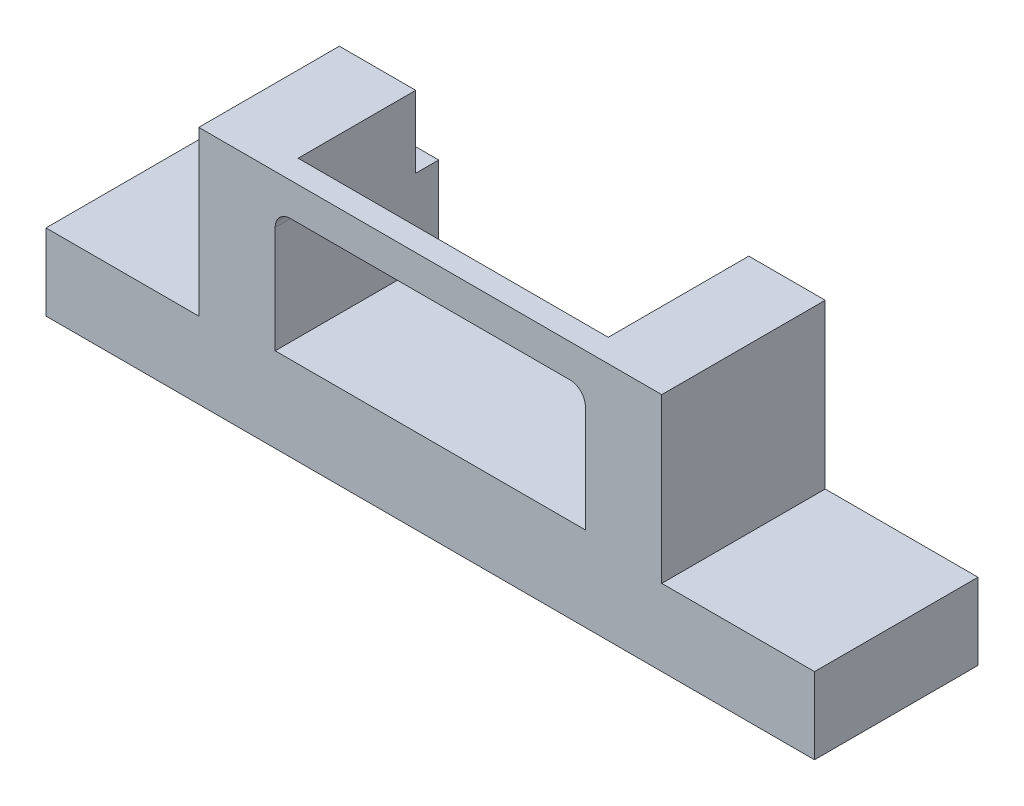
ISO-10303-21;
HEADER;
FILE_DESCRIPTION(('STEP AP214'),'2;1');
FILE_NAME('part.step','',(''),(''),'','','');
FILE_SCHEMA(('AUTOMOTIVE_DESIGN { 1 0 10303 214 1 1 1 1 }'));
ENDSEC;
DATA;
#1=APPLICATION_CONTEXT('core data for automotive mechanical design processes');
#2=APPLICATION_PROTOCOL_DEFINITION('international standard','automotive_design',2000,#1);
#3=PRODUCT_CONTEXT('',#1,'mechanical');
#4=PRODUCT('Part','Part','',(#3));
#5=PRODUCT_RELATED_PRODUCT_CATEGORY('part','',(#4));
#6=PRODUCT_DEFINITION_FORMATION('','',#4);
#7=PRODUCT_DEFINITION_CONTEXT('part definition',#1,'design');
#8=PRODUCT_DEFINITION('design','',#6,#7);
#9=PRODUCT_DEFINITION_SHAPE('','',#8);
#10=(LENGTH_UNIT() NAMED_UNIT(*) SI_UNIT(.MILLI.,.METRE.));
#11=(NAMED_UNIT(*) PLANE_ANGLE_UNIT() SI_UNIT($,.RADIAN.));
#12=(NAMED_UNIT(*) SI_UNIT($,.STERADIAN.) SOLID_ANGLE_UNIT());
#13=UNCERTAINTY_MEASURE_WITH_UNIT(LENGTH_MEASURE(1.E-05),#10,'distance_accuracy_value','');
#14=(GEOMETRIC_REPRESENTATION_CONTEXT(3) GLOBAL_UNCERTAINTY_ASSIGNED_CONTEXT((#13)) GLOBAL_UNIT_ASSIGNED_CONTEXT((#10,
#11,#12)) REPRESENTATION_CONTEXT('',''));
#15=CARTESIAN_POINT('',(0.,0.,0.));
#16=DIRECTION('',(0.,0.,1.));
#17=DIRECTION('',(1.,0.,0.));
#18=AXIS2_PLACEMENT_3D('',#15,#16,#17);
#19=CARTESIAN_POINT('',(0.,15.7,0.));
#20=DIRECTION('',(-1.,0.,0.));
#21=DIRECTION('',(0.,0.,1.));
#22=AXIS2_PLACEMENT_3D('',#19,#20,#21);
#23=PLANE('',#22);
#24=DIRECTION('',(0.,-1.,0.));
#25=VECTOR('',#24,1.);
#26=CARTESIAN_POINT('',(0.,15.7,0.));
#27=LINE('',#26,#25);
#28=CARTESIAN_POINT('',(0.,5.00000000000001,0.));
#29=VERTEX_POINT('',#28);
#30=CARTESIAN_POINT('',(0.,0.,0.));
#31=VERTEX_POINT('',#30);
#32=EDGE_CURVE('E11',#29,#31,#27,.T.);
#33=ORIENTED_EDGE('',*,*,#32,.F.);
#34=DIRECTION('',(0.,0.,1.));
#35=VECTOR('',#34,1.);
#36=CARTESIAN_POINT('',(0.,5.00000000000001,-0.000999999999999265));
#37=LINE('',#36,#35);
#38=CARTESIAN_POINT('',(0.,5.00000000000001,10.7));
#39=VERTEX_POINT('',#38);
#40=EDGE_CURVE('E304',#29,#39,#37,.T.);
#41=ORIENTED_EDGE('',*,*,#40,.T.);
#42=DIRECTION('',(0.,-1.,0.));
#43=VECTOR('',#42,1.);
#44=CARTESIAN_POINT('',(0.,15.7,10.7));
#45=LINE('',#44,#43);
#46=CARTESIAN_POINT('',(0.,0.,10.7));
#47=VERTEX_POINT('',#46);
#48=EDGE_CURVE('E250',#39,#47,#45,.T.);
#49=ORIENTED_EDGE('',*,*,#48,.T.);
#50=DIRECTION('',(0.,0.,-1.));
#51=VECTOR('',#50,1.);
#52=CARTESIAN_POINT('',(0.,0.,0.));
#53=LINE('',#52,#51);
#54=EDGE_CURVE('E251',#47,#31,#53,.T.);
#55=ORIENTED_EDGE('',*,*,#54,.T.);
#56=EDGE_LOOP('',(#33,#41,#49,#55));
#57=FACE_BOUND('',#56,.T.);
#58=ADVANCED_FACE('F39',(#57),#23,.F.);
#59=CARTESIAN_POINT('',(0.,15.7,0.));
#60=DIRECTION('',(0.,0.,1.));
#61=DIRECTION('',(1.,0.,0.));
#62=AXIS2_PLACEMENT_3D('',#59,#60,#61);
#63=PLANE('',#62);
#64=DIRECTION('',(0.,-1.,0.));
#65=VECTOR('',#64,1.);
#66=CARTESIAN_POINT('',(-40.3,5.00000000000001,0.));
#67=LINE('',#66,#65);
#68=CARTESIAN_POINT('',(-40.3,11.,0.));
#69=VERTEX_POINT('',#68);
#70=CARTESIAN_POINT('',(-40.3,5.00000000000001,0.));
#71=VERTEX_POINT('',#70);
#72=EDGE_CURVE('E182',#69,#71,#67,.T.);
#73=ORIENTED_EDGE('',*,*,#72,.F.);
#74=DIRECTION('',(-1.,0.,0.));
#75=VECTOR('',#74,1.);
#76=CARTESIAN_POINT('',(0.001000000000001,11.,0.));
#77=LINE('',#76,#75);
#78=CARTESIAN_POINT('',(-35.3,11.,0.));
#79=VERTEX_POINT('',#78);
#80=EDGE_CURVE('E166',#79,#69,#77,.T.);
#81=ORIENTED_EDGE('',*,*,#80,.F.);
#82=DIRECTION('',(0.,1.,0.));
#83=VECTOR('',#82,1.);
#84=CARTESIAN_POINT('',(-35.3,12.5329063094467,0.));
#85=LINE('',#84,#83);
#86=CARTESIAN_POINT('',(-35.3,5.5329063094467,0.));
#87=VERTEX_POINT('',#86);
#88=EDGE_CURVE('E180',#87,#79,#85,.T.);
#89=ORIENTED_EDGE('',*,*,#88,.F.);
#90=DIRECTION('',(-1.,0.,0.));
#91=VECTOR('',#90,1.);
#92=CARTESIAN_POINT('',(-35.3,5.5329063094467,0.));
#93=LINE('',#92,#91);
#94=CARTESIAN_POINT('',(-15.,5.5329063094467,0.));
#95=VERTEX_POINT('',#94);
#96=EDGE_CURVE('E223',#95,#87,#93,.T.);
#97=ORIENTED_EDGE('',*,*,#96,.F.);
#98=DIRECTION('',(0.,-1.,0.));
#99=VECTOR('',#98,1.);
#100=CARTESIAN_POINT('',(-15.,12.5329063094467,0.));
#101=LINE('',#100,#99);
#102=CARTESIAN_POINT('',(-15.,15.7,0.));
#103=VERTEX_POINT('',#102);
#104=EDGE_CURVE('E62',#103,#95,#101,.T.);
#105=ORIENTED_EDGE('',*,*,#104,.F.);
#106=DIRECTION('',(-1.,0.,0.));
#107=VECTOR('',#106,1.);
#108=CARTESIAN_POINT('',(0.,15.7,0.));
#109=LINE('',#108,#107);
#110=CARTESIAN_POINT('',(-10.,15.7,0.));
#111=VERTEX_POINT('',#110);
#112=EDGE_CURVE('E241',#111,#103,#109,.T.);
#113=ORIENTED_EDGE('',*,*,#112,.F.);
#114=DIRECTION('',(0.,1.,0.));
#115=VECTOR('',#114,1.);
#116=CARTESIAN_POINT('',(-10.,5.00000000000001,0.));
#117=LINE('',#116,#115);
#118=CARTESIAN_POINT('',(-10.,5.00000000000001,0.));
#119=VERTEX_POINT('',#118);
#120=EDGE_CURVE('E240',#119,#111,#117,.T.);
#121=ORIENTED_EDGE('',*,*,#120,.F.);
#122=DIRECTION('',(-1.,0.,0.));
#123=VECTOR('',#122,1.);
#124=CARTESIAN_POINT('',(0.,5.00000000000001,0.));
#125=LINE('',#124,#123);
#126=EDGE_CURVE('E320',#29,#119,#125,.T.);
#127=ORIENTED_EDGE('',*,*,#126,.F.);
#128=ORIENTED_EDGE('',*,*,#32,.T.);
#129=DIRECTION('',(-1.,0.,0.));
#130=VECTOR('',#129,1.);
#131=CARTESIAN_POINT('',(0.,0.,0.));
#132=LINE('',#131,#130);
#133=CARTESIAN_POINT('',(-50.3,0.,0.));
#134=VERTEX_POINT('',#133);
#135=EDGE_CURVE('E255',#31,#134,#132,.T.);
#136=ORIENTED_EDGE('',*,*,#135,.T.);
#137=DIRECTION('',(0.,-1.,0.));
#138=VECTOR('',#137,1.);
#139=CARTESIAN_POINT('',(-50.3,15.7,0.));
#140=LINE('',#139,#138);
#141=CARTESIAN_POINT('',(-50.3,5.00000000000001,0.));
#142=VERTEX_POINT('',#141);
#143=EDGE_CURVE('E47',#142,#134,#140,.T.);
#144=ORIENTED_EDGE('',*,*,#143,.F.);
#145=DIRECTION('',(-1.,0.,0.));
#146=VECTOR('',#145,1.);
#147=CARTESIAN_POINT('',(-50.3,5.00000000000001,0.));
#148=LINE('',#147,#146);
#149=EDGE_CURVE('E256',#71,#142,#148,.T.);
#150=ORIENTED_EDGE('',*,*,#149,.F.);
#151=EDGE_LOOP('',(#73,#81,#89,#97,#105,#113,#121,#127,#128,#136,#144,#150));
#152=FACE_BOUND('',#151,.T.);
#153=ADVANCED_FACE('F178',(#152),#63,.F.);
#154=CARTESIAN_POINT('',(-50.3,15.7,0.));
#155=DIRECTION('',(1.,0.,0.));
#156=DIRECTION('',(0.,0.,-1.));
#157=AXIS2_PLACEMENT_3D('',#154,#155,#156);
#158=PLANE('',#157);
#159=DIRECTION('',(0.,-1.,0.));
#160=VECTOR('',#159,1.);
#161=CARTESIAN_POINT('',(-50.3,15.7,10.7));
#162=LINE('',#161,#160);
#163=CARTESIAN_POINT('',(-50.3,5.00000000000001,10.7));
#164=VERTEX_POINT('',#163);
#165=CARTESIAN_POINT('',(-50.3,0.,10.7));
#166=VERTEX_POINT('',#165);
#167=EDGE_CURVE('E269',#164,#166,#162,.T.);
#168=ORIENTED_EDGE('',*,*,#167,.F.);
#169=DIRECTION('',(0.,0.,1.));
#170=VECTOR('',#169,1.);
#171=CARTESIAN_POINT('',(-50.3,5.00000000000001,-0.000999999999999265));
#172=LINE('',#171,#170);
#173=EDGE_CURVE('E279',#142,#164,#172,.T.);
#174=ORIENTED_EDGE('',*,*,#173,.F.);
#175=ORIENTED_EDGE('',*,*,#143,.T.);
#176=DIRECTION('',(0.,0.,1.));
#177=VECTOR('',#176,1.);
#178=CARTESIAN_POINT('',(-50.3,0.,0.));
#179=LINE('',#178,#177);
#180=EDGE_CURVE('E260',#134,#166,#179,.T.);
#181=ORIENTED_EDGE('',*,*,#180,.T.);
#182=EDGE_LOOP('',(#168,#174,#175,#181));
#183=FACE_BOUND('',#182,.T.);
#184=ADVANCED_FACE('F276',(#183),#158,.F.);
#185=CARTESIAN_POINT('',(0.,15.7,10.7));
#186=DIRECTION('',(0.,0.,-1.));
#187=DIRECTION('',(-1.,0.,0.));
#188=AXIS2_PLACEMENT_3D('',#185,#186,#187);
#189=PLANE('',#188);
#190=DIRECTION('',(1.,0.,0.));
#191=VECTOR('',#190,1.);
#192=CARTESIAN_POINT('',(-35.3,5.5329063094467,10.7));
#193=LINE('',#192,#191);
#194=CARTESIAN_POINT('',(-35.3,5.5329063094467,10.7));
#195=VERTEX_POINT('',#194);
#196=CARTESIAN_POINT('',(-15.,5.5329063094467,10.7));
#197=VERTEX_POINT('',#196);
#198=EDGE_CURVE('E195',#195,#197,#193,.T.);
#199=ORIENTED_EDGE('',*,*,#198,.F.);
#200=DIRECTION('',(0.,-1.,0.));
#201=VECTOR('',#200,1.);
#202=CARTESIAN_POINT('',(-35.3,12.5329063094467,10.7));
#203=LINE('',#202,#201);
#204=CARTESIAN_POINT('',(-35.3,12.5329063094467,10.7));
#205=VERTEX_POINT('',#204);
#206=EDGE_CURVE('E191',#205,#195,#203,.T.);
#207=ORIENTED_EDGE('',*,*,#206,.F.);
#208=CARTESIAN_POINT('',(-34.3,12.5329063094467,10.7));
#209=DIRECTION('',(0.,0.,1.));
#210=DIRECTION('',(1.,0.,0.));
#211=AXIS2_PLACEMENT_3D('',#208,#209,#210);
#212=CIRCLE('',#211,1.);
#213=CARTESIAN_POINT('',(-34.3,13.5329063094467,10.7));
#214=VERTEX_POINT('',#213);
#215=EDGE_CURVE('E216',#214,#205,#212,.T.);
#216=ORIENTED_EDGE('',*,*,#215,.F.);
#217=DIRECTION('',(-1.,0.,0.));
#218=VECTOR('',#217,1.);
#219=CARTESIAN_POINT('',(-34.3,13.5329063094467,10.7));
#220=LINE('',#219,#218);
#221=CARTESIAN_POINT('',(-16.,13.5329063094467,10.7));
#222=VERTEX_POINT('',#221);
#223=EDGE_CURVE('E212',#222,#214,#220,.T.);
#224=ORIENTED_EDGE('',*,*,#223,.F.);
#225=CARTESIAN_POINT('',(-16.,12.5329063094467,10.7));
#226=DIRECTION('',(0.,0.,1.));
#227=DIRECTION('',(1.,0.,0.));
#228=AXIS2_PLACEMENT_3D('',#225,#226,#227);
#229=CIRCLE('',#228,1.);
#230=CARTESIAN_POINT('',(-15.,12.5329063094467,10.7));
#231=VERTEX_POINT('',#230);
#232=EDGE_CURVE('E208',#231,#222,#229,.T.);
#233=ORIENTED_EDGE('',*,*,#232,.F.);
#234=DIRECTION('',(0.,1.,0.));
#235=VECTOR('',#234,1.);
#236=CARTESIAN_POINT('',(-15.,12.5329063094467,10.7));
#237=LINE('',#236,#235);
#238=EDGE_CURVE('E204',#197,#231,#237,.T.);
#239=ORIENTED_EDGE('',*,*,#238,.F.);
#240=EDGE_LOOP('',(#199,#207,#216,#224,#233,#239));
#241=FACE_BOUND('',#240,.T.);
#242=DIRECTION('',(1.,0.,0.));
#243=VECTOR('',#242,1.);
#244=CARTESIAN_POINT('',(0.,15.7,10.7));
#245=LINE('',#244,#243);
#246=CARTESIAN_POINT('',(-40.3,15.7,10.7));
#247=VERTEX_POINT('',#246);
#248=CARTESIAN_POINT('',(-10.,15.7,10.7));
#249=VERTEX_POINT('',#248);
#250=EDGE_CURVE('E245',#247,#249,#245,.T.);
#251=ORIENTED_EDGE('',*,*,#250,.F.);
#252=DIRECTION('',(0.,1.,0.));
#253=VECTOR('',#252,1.);
#254=CARTESIAN_POINT('',(-40.3,5.00000000000001,10.7));
#255=LINE('',#254,#253);
#256=CARTESIAN_POINT('',(-40.3,5.00000000000001,10.7));
#257=VERTEX_POINT('',#256);
#258=EDGE_CURVE('E296',#257,#247,#255,.T.);
#259=ORIENTED_EDGE('',*,*,#258,.F.);
#260=DIRECTION('',(1.,0.,0.));
#261=VECTOR('',#260,1.);
#262=CARTESIAN_POINT('',(-50.3,5.00000000000001,10.7));
#263=LINE('',#262,#261);
#264=EDGE_CURVE('E294',#164,#257,#263,.T.);
#265=ORIENTED_EDGE('',*,*,#264,.F.);
#266=ORIENTED_EDGE('',*,*,#167,.T.);
#267=DIRECTION('',(1.,0.,0.));
#268=VECTOR('',#267,1.);
#269=CARTESIAN_POINT('',(0.,0.,10.7));
#270=LINE('',#269,#268);
#271=EDGE_CURVE('E246',#166,#47,#270,.T.);
#272=ORIENTED_EDGE('',*,*,#271,.T.);
#273=ORIENTED_EDGE('',*,*,#48,.F.);
#274=DIRECTION('',(1.,0.,0.));
#275=VECTOR('',#274,1.);
#276=CARTESIAN_POINT('',(0.,5.00000000000001,10.7));
#277=LINE('',#276,#275);
#278=CARTESIAN_POINT('',(-10.,5.00000000000001,10.7));
#279=VERTEX_POINT('',#278);
#280=EDGE_CURVE('E328',#279,#39,#277,.T.);
#281=ORIENTED_EDGE('',*,*,#280,.F.);
#282=DIRECTION('',(0.,-1.,0.));
#283=VECTOR('',#282,1.);
#284=CARTESIAN_POINT('',(-10.,5.00000000000001,10.7));
#285=LINE('',#284,#283);
#286=EDGE_CURVE('E324',#249,#279,#285,.T.);
#287=ORIENTED_EDGE('',*,*,#286,.F.);
#288=EDGE_LOOP('',(#251,#259,#265,#266,#272,#273,#281,#287));
#289=FACE_BOUND('',#288,.T.);
#290=ADVANCED_FACE('F289',(#241,#289),#189,.F.);
#291=CARTESIAN_POINT('',(0.,15.7,0.));
#292=DIRECTION('',(0.,-1.,0.));
#293=DIRECTION('',(0.,0.,-1.));
#294=AXIS2_PLACEMENT_3D('',#291,#292,#293);
#295=PLANE('',#294);
#296=DIRECTION('',(0.,0.,1.));
#297=VECTOR('',#296,1.);
#298=CARTESIAN_POINT('',(-35.3,15.7,0.));
#299=LINE('',#298,#297);
#300=CARTESIAN_POINT('',(-35.3,15.7,1.5));
#301=VERTEX_POINT('',#300);
#302=CARTESIAN_POINT('',(-35.3,15.7,9.2));
#303=VERTEX_POINT('',#302);
#304=EDGE_CURVE('E172',#301,#303,#299,.T.);
#305=ORIENTED_EDGE('',*,*,#304,.F.);
#306=DIRECTION('',(-1.,0.,0.));
#307=VECTOR('',#306,1.);
#308=CARTESIAN_POINT('',(0.001000000000001,15.7,1.5));
#309=LINE('',#308,#307);
#310=CARTESIAN_POINT('',(-40.3,15.7,1.5));
#311=VERTEX_POINT('',#310);
#312=EDGE_CURVE('E173',#301,#311,#309,.T.);
#313=ORIENTED_EDGE('',*,*,#312,.T.);
#314=DIRECTION('',(0.,0.,1.));
#315=VECTOR('',#314,1.);
#316=CARTESIAN_POINT('',(-40.3,15.7,-0.000999999999999265));
#317=LINE('',#316,#315);
#318=EDGE_CURVE('E308',#311,#247,#317,.T.);
#319=ORIENTED_EDGE('',*,*,#318,.T.);
#320=ORIENTED_EDGE('',*,*,#250,.T.);
#321=DIRECTION('',(0.,0.,1.));
#322=VECTOR('',#321,1.);
#323=CARTESIAN_POINT('',(-10.,15.7,-0.000999999999999265));
#324=LINE('',#323,#322);
#325=EDGE_CURVE('E331',#111,#249,#324,.T.);
#326=ORIENTED_EDGE('',*,*,#325,.F.);
#327=ORIENTED_EDGE('',*,*,#112,.T.);
#328=DIRECTION('',(0.,0.,-1.));
#329=VECTOR('',#328,1.);
#330=CARTESIAN_POINT('',(-15.,15.7,0.));
#331=LINE('',#330,#329);
#332=CARTESIAN_POINT('',(-15.,15.7,9.2));
#333=VERTEX_POINT('',#332);
#334=EDGE_CURVE('E372',#333,#103,#331,.T.);
#335=ORIENTED_EDGE('',*,*,#334,.F.);
#336=DIRECTION('',(1.,0.,0.));
#337=VECTOR('',#336,1.);
#338=CARTESIAN_POINT('',(-35.3,15.7,9.2));
#339=LINE('',#338,#337);
#340=EDGE_CURVE('E374',#303,#333,#339,.T.);
#341=ORIENTED_EDGE('',*,*,#340,.F.);
#342=EDGE_LOOP('',(#305,#313,#319,#320,#326,#327,#335,#341));
#343=FACE_BOUND('',#342,.T.);
#344=ADVANCED_FACE('F346',(#343),#295,.F.);
#345=CARTESIAN_POINT('',(0.,0.,0.));
#346=DIRECTION('',(0.,-1.,0.));
#347=DIRECTION('',(0.,0.,-1.));
#348=AXIS2_PLACEMENT_3D('',#345,#346,#347);
#349=PLANE('',#348);
#350=ORIENTED_EDGE('',*,*,#54,.F.);
#351=ORIENTED_EDGE('',*,*,#271,.F.);
#352=ORIENTED_EDGE('',*,*,#180,.F.);
#353=ORIENTED_EDGE('',*,*,#135,.F.);
#354=EDGE_LOOP('',(#350,#351,#352,#353));
#355=FACE_BOUND('',#354,.T.);
#356=ADVANCED_FACE('F285',(#355),#349,.T.);
#357=CARTESIAN_POINT('',(0.,5.00000000000001,-0.000999999999999265));
#358=DIRECTION('',(0.,-1.,0.));
#359=DIRECTION('',(0.,0.,-1.));
#360=AXIS2_PLACEMENT_3D('',#357,#358,#359);
#361=PLANE('',#360);
#362=ORIENTED_EDGE('',*,*,#126,.T.);
#363=DIRECTION('',(0.,0.,1.));
#364=VECTOR('',#363,1.);
#365=CARTESIAN_POINT('',(-10.,5.00000000000001,-0.000999999999999265));
#366=LINE('',#365,#364);
#367=EDGE_CURVE('E335',#119,#279,#366,.T.);
#368=ORIENTED_EDGE('',*,*,#367,.T.);
#369=ORIENTED_EDGE('',*,*,#280,.T.);
#370=ORIENTED_EDGE('',*,*,#40,.F.);
#371=EDGE_LOOP('',(#362,#368,#369,#370));
#372=FACE_BOUND('',#371,.T.);
#373=ADVANCED_FACE('F369',(#372),#361,.F.);
#374=CARTESIAN_POINT('',(-10.,5.00000000000001,-0.000999999999999265));
#375=DIRECTION('',(-1.,0.,0.));
#376=DIRECTION('',(0.,0.,1.));
#377=AXIS2_PLACEMENT_3D('',#374,#375,#376);
#378=PLANE('',#377);
#379=ORIENTED_EDGE('',*,*,#120,.T.);
#380=ORIENTED_EDGE('',*,*,#325,.T.);
#381=ORIENTED_EDGE('',*,*,#286,.T.);
#382=ORIENTED_EDGE('',*,*,#367,.F.);
#383=EDGE_LOOP('',(#379,#380,#381,#382));
#384=FACE_BOUND('',#383,.T.);
#385=ADVANCED_FACE('F341',(#384),#378,.F.);
#386=CARTESIAN_POINT('',(-40.3,5.00000000000001,-0.000999999999999265));
#387=DIRECTION('',(1.,0.,0.));
#388=DIRECTION('',(0.,0.,-1.));
#389=AXIS2_PLACEMENT_3D('',#386,#387,#388);
#390=PLANE('',#389);
#391=ORIENTED_EDGE('',*,*,#318,.F.);
#392=DIRECTION('',(0.,1.,0.));
#393=VECTOR('',#392,1.);
#394=CARTESIAN_POINT('',(-40.3,15.7,1.5));
#395=LINE('',#394,#393);
#396=CARTESIAN_POINT('',(-40.3,11.,1.5));
#397=VERTEX_POINT('',#396);
#398=EDGE_CURVE('E184',#397,#311,#395,.T.);
#399=ORIENTED_EDGE('',*,*,#398,.F.);
#400=DIRECTION('',(0.,0.,1.));
#401=VECTOR('',#400,1.);
#402=CARTESIAN_POINT('',(-40.3,11.,0.));
#403=LINE('',#402,#401);
#404=EDGE_CURVE('E412',#69,#397,#403,.T.);
#405=ORIENTED_EDGE('',*,*,#404,.F.);
#406=ORIENTED_EDGE('',*,*,#72,.T.);
#407=DIRECTION('',(0.,0.,1.));
#408=VECTOR('',#407,1.);
#409=CARTESIAN_POINT('',(-40.3,5.00000000000001,-0.000999999999999265));
#410=LINE('',#409,#408);
#411=EDGE_CURVE('E311',#71,#257,#410,.T.);
#412=ORIENTED_EDGE('',*,*,#411,.T.);
#413=ORIENTED_EDGE('',*,*,#258,.T.);
#414=EDGE_LOOP('',(#391,#399,#405,#406,#412,#413));
#415=FACE_BOUND('',#414,.T.);
#416=ADVANCED_FACE('F351',(#415),#390,.F.);
#417=CARTESIAN_POINT('',(-50.3,5.00000000000001,-0.000999999999999265));
#418=DIRECTION('',(0.,-1.,0.));
#419=DIRECTION('',(0.,0.,-1.));
#420=AXIS2_PLACEMENT_3D('',#417,#418,#419);
#421=PLANE('',#420);
#422=ORIENTED_EDGE('',*,*,#149,.T.);
#423=ORIENTED_EDGE('',*,*,#173,.T.);
#424=ORIENTED_EDGE('',*,*,#264,.T.);
#425=ORIENTED_EDGE('',*,*,#411,.F.);
#426=EDGE_LOOP('',(#422,#423,#424,#425));
#427=FACE_BOUND('',#426,.T.);
#428=ADVANCED_FACE('F352',(#427),#421,.F.);
#429=CARTESIAN_POINT('',(-35.3,12.5329063094467,-0.000999999999999265));
#430=DIRECTION('',(-1.,0.,0.));
#431=DIRECTION('',(0.,0.,1.));
#432=AXIS2_PLACEMENT_3D('',#429,#430,#431);
#433=PLANE('',#432);
#434=DIRECTION('',(0.,0.,-1.));
#435=VECTOR('',#434,1.);
#436=CARTESIAN_POINT('',(-35.3,11.,0.));
#437=LINE('',#436,#435);
#438=CARTESIAN_POINT('',(-35.3,11.,1.5));
#439=VERTEX_POINT('',#438);
#440=EDGE_CURVE('E162',#439,#79,#437,.T.);
#441=ORIENTED_EDGE('',*,*,#440,.F.);
#442=DIRECTION('',(0.,-1.,0.));
#443=VECTOR('',#442,1.);
#444=CARTESIAN_POINT('',(-35.3,15.7,1.5));
#445=LINE('',#444,#443);
#446=EDGE_CURVE('E54',#301,#439,#445,.T.);
#447=ORIENTED_EDGE('',*,*,#446,.F.);
#448=ORIENTED_EDGE('',*,*,#304,.T.);
#449=DIRECTION('',(0.,1.,0.));
#450=VECTOR('',#449,1.);
#451=CARTESIAN_POINT('',(-35.3,-0.001000000000001,9.2));
#452=LINE('',#451,#450);
#453=CARTESIAN_POINT('',(-35.3,12.5329063094467,9.2));
#454=VERTEX_POINT('',#453);
#455=EDGE_CURVE('E376',#454,#303,#452,.T.);
#456=ORIENTED_EDGE('',*,*,#455,.F.);
#457=DIRECTION('',(0.,0.,1.));
#458=VECTOR('',#457,1.);
#459=CARTESIAN_POINT('',(-35.3,12.5329063094467,-0.000999999999999265));
#460=LINE('',#459,#458);
#461=EDGE_CURVE('E220',#454,#205,#460,.T.);
#462=ORIENTED_EDGE('',*,*,#461,.T.);
#463=ORIENTED_EDGE('',*,*,#206,.T.);
#464=DIRECTION('',(0.,0.,1.));
#465=VECTOR('',#464,1.);
#466=CARTESIAN_POINT('',(-35.3,5.5329063094467,-0.000999999999999265));
#467=LINE('',#466,#465);
#468=EDGE_CURVE('E188',#87,#195,#467,.T.);
#469=ORIENTED_EDGE('',*,*,#468,.F.);
#470=ORIENTED_EDGE('',*,*,#88,.T.);
#471=EDGE_LOOP('',(#441,#447,#448,#456,#462,#463,#469,#470));
#472=FACE_BOUND('',#471,.T.);
#473=ADVANCED_FACE('F186',(#472),#433,.F.);
#474=CARTESIAN_POINT('',(-34.3,12.5329063094467,-0.000999999999999265));
#475=DIRECTION('',(0.,0.,1.));
#476=DIRECTION('',(1.,0.,0.));
#477=AXIS2_PLACEMENT_3D('',#474,#475,#476);
#478=CYLINDRICAL_SURFACE('',#477,1.);
#479=ORIENTED_EDGE('',*,*,#461,.F.);
#480=CARTESIAN_POINT('',(-34.3,12.5329063094467,9.2));
#481=DIRECTION('',(0.,0.,1.));
#482=DIRECTION('',(1.,0.,0.));
#483=AXIS2_PLACEMENT_3D('',#480,#481,#482);
#484=CIRCLE('',#483,1.);
#485=CARTESIAN_POINT('',(-34.3,13.5329063094467,9.2));
#486=VERTEX_POINT('',#485);
#487=EDGE_CURVE('E197',#486,#454,#484,.T.);
#488=ORIENTED_EDGE('',*,*,#487,.F.);
#489=DIRECTION('',(0.,0.,1.));
#490=VECTOR('',#489,1.);
#491=CARTESIAN_POINT('',(-34.3,13.5329063094467,-0.000999999999999265));
#492=LINE('',#491,#490);
#493=EDGE_CURVE('E224',#486,#214,#492,.T.);
#494=ORIENTED_EDGE('',*,*,#493,.T.);
#495=ORIENTED_EDGE('',*,*,#215,.T.);
#496=EDGE_LOOP('',(#479,#488,#494,#495));
#497=FACE_BOUND('',#496,.T.);
#498=ADVANCED_FACE('F359',(#497),#478,.F.);
#499=CARTESIAN_POINT('',(-34.3,13.5329063094467,-0.000999999999999265));
#500=DIRECTION('',(0.,1.,0.));
#501=DIRECTION('',(0.,0.,1.));
#502=AXIS2_PLACEMENT_3D('',#499,#500,#501);
#503=PLANE('',#502);
#504=ORIENTED_EDGE('',*,*,#493,.F.);
#505=DIRECTION('',(-1.,0.,0.));
#506=VECTOR('',#505,1.);
#507=CARTESIAN_POINT('',(-35.3,13.5329063094467,9.2));
#508=LINE('',#507,#506);
#509=CARTESIAN_POINT('',(-16.,13.5329063094467,9.2));
#510=VERTEX_POINT('',#509);
#511=EDGE_CURVE('E391',#510,#486,#508,.T.);
#512=ORIENTED_EDGE('',*,*,#511,.F.);
#513=DIRECTION('',(0.,0.,1.));
#514=VECTOR('',#513,1.);
#515=CARTESIAN_POINT('',(-16.,13.5329063094467,-0.000999999999999265));
#516=LINE('',#515,#514);
#517=EDGE_CURVE('E227',#510,#222,#516,.T.);
#518=ORIENTED_EDGE('',*,*,#517,.T.);
#519=ORIENTED_EDGE('',*,*,#223,.T.);
#520=EDGE_LOOP('',(#504,#512,#518,#519));
#521=FACE_BOUND('',#520,.T.);
#522=ADVANCED_FACE('F520',(#521),#503,.F.);
#523=CARTESIAN_POINT('',(-16.,12.5329063094467,-0.000999999999999265));
#524=DIRECTION('',(0.,0.,1.));
#525=DIRECTION('',(1.,0.,0.));
#526=AXIS2_PLACEMENT_3D('',#523,#524,#525);
#527=CYLINDRICAL_SURFACE('',#526,1.);
#528=ORIENTED_EDGE('',*,*,#517,.F.);
#529=CARTESIAN_POINT('',(-16.,12.5329063094467,9.2));
#530=DIRECTION('',(0.,0.,1.));
#531=DIRECTION('',(1.,0.,0.));
#532=AXIS2_PLACEMENT_3D('',#529,#530,#531);
#533=CIRCLE('',#532,1.);
#534=CARTESIAN_POINT('',(-15.,12.5329063094467,9.2));
#535=VERTEX_POINT('',#534);
#536=EDGE_CURVE('E387',#535,#510,#533,.T.);
#537=ORIENTED_EDGE('',*,*,#536,.F.);
#538=DIRECTION('',(0.,0.,1.));
#539=VECTOR('',#538,1.);
#540=CARTESIAN_POINT('',(-15.,12.5329063094467,-0.000999999999999265));
#541=LINE('',#540,#539);
#542=EDGE_CURVE('E230',#535,#231,#541,.T.);
#543=ORIENTED_EDGE('',*,*,#542,.T.);
#544=ORIENTED_EDGE('',*,*,#232,.T.);
#545=EDGE_LOOP('',(#528,#537,#543,#544));
#546=FACE_BOUND('',#545,.T.);
#547=ADVANCED_FACE('F435',(#546),#527,.F.);
#548=CARTESIAN_POINT('',(-15.,12.5329063094467,-0.000999999999999265));
#549=DIRECTION('',(1.,0.,0.));
#550=DIRECTION('',(0.,0.,-1.));
#551=AXIS2_PLACEMENT_3D('',#548,#549,#550);
#552=PLANE('',#551);
#553=ORIENTED_EDGE('',*,*,#104,.T.);
#554=DIRECTION('',(0.,0.,1.));
#555=VECTOR('',#554,1.);
#556=CARTESIAN_POINT('',(-15.,5.5329063094467,-0.000999999999999265));
#557=LINE('',#556,#555);
#558=EDGE_CURVE('E233',#95,#197,#557,.T.);
#559=ORIENTED_EDGE('',*,*,#558,.T.);
#560=ORIENTED_EDGE('',*,*,#238,.T.);
#561=ORIENTED_EDGE('',*,*,#542,.F.);
#562=DIRECTION('',(0.,1.,0.));
#563=VECTOR('',#562,1.);
#564=CARTESIAN_POINT('',(-15.,-0.001000000000001,9.2));
#565=LINE('',#564,#563);
#566=EDGE_CURVE('E381',#535,#333,#565,.T.);
#567=ORIENTED_EDGE('',*,*,#566,.T.);
#568=ORIENTED_EDGE('',*,*,#334,.T.);
#569=EDGE_LOOP('',(#553,#559,#560,#561,#567,#568));
#570=FACE_BOUND('',#569,.T.);
#571=ADVANCED_FACE('F429',(#570),#552,.F.);
#572=CARTESIAN_POINT('',(-35.3,5.5329063094467,-0.000999999999999265));
#573=DIRECTION('',(0.,-1.,0.));
#574=DIRECTION('',(0.,0.,-1.));
#575=AXIS2_PLACEMENT_3D('',#572,#573,#574);
#576=PLANE('',#575);
#577=ORIENTED_EDGE('',*,*,#96,.T.);
#578=ORIENTED_EDGE('',*,*,#468,.T.);
#579=ORIENTED_EDGE('',*,*,#198,.T.);
#580=ORIENTED_EDGE('',*,*,#558,.F.);
#581=EDGE_LOOP('',(#577,#578,#579,#580));
#582=FACE_BOUND('',#581,.T.);
#583=ADVANCED_FACE('F424',(#582),#576,.F.);
#584=CARTESIAN_POINT('',(-35.3,-0.001000000000001,9.2));
#585=DIRECTION('',(0.,0.,1.));
#586=DIRECTION('',(1.,0.,0.));
#587=AXIS2_PLACEMENT_3D('',#584,#585,#586);
#588=PLANE('',#587);
#589=ORIENTED_EDGE('',*,*,#487,.T.);
#590=ORIENTED_EDGE('',*,*,#455,.T.);
#591=ORIENTED_EDGE('',*,*,#340,.T.);
#592=ORIENTED_EDGE('',*,*,#566,.F.);
#593=ORIENTED_EDGE('',*,*,#536,.T.);
#594=ORIENTED_EDGE('',*,*,#511,.T.);
#595=EDGE_LOOP('',(#589,#590,#591,#592,#593,#594));
#596=FACE_BOUND('',#595,.T.);
#597=ADVANCED_FACE('F398',(#596),#588,.F.);
#598=CARTESIAN_POINT('',(0.001000000000001,15.7,1.5));
#599=DIRECTION('',(0.,0.,1.));
#600=DIRECTION('',(0.,-1.,0.));
#601=AXIS2_PLACEMENT_3D('',#598,#599,#600);
#602=PLANE('',#601);
#603=ORIENTED_EDGE('',*,*,#446,.T.);
#604=DIRECTION('',(-1.,0.,0.));
#605=VECTOR('',#604,1.);
#606=CARTESIAN_POINT('',(0.001000000000001,11.,1.5));
#607=LINE('',#606,#605);
#608=EDGE_CURVE('E168',#439,#397,#607,.T.);
#609=ORIENTED_EDGE('',*,*,#608,.T.);
#610=ORIENTED_EDGE('',*,*,#398,.T.);
#611=ORIENTED_EDGE('',*,*,#312,.F.);
#612=EDGE_LOOP('',(#603,#609,#610,#611));
#613=FACE_BOUND('',#612,.T.);
#614=ADVANCED_FACE('F416',(#613),#602,.F.);
#615=CARTESIAN_POINT('',(0.001000000000001,11.,0.));
#616=DIRECTION('',(0.,-1.,0.));
#617=DIRECTION('',(0.,0.,-1.));
#618=AXIS2_PLACEMENT_3D('',#615,#616,#617);
#619=PLANE('',#618);
#620=ORIENTED_EDGE('',*,*,#440,.T.);
#621=ORIENTED_EDGE('',*,*,#80,.T.);
#622=ORIENTED_EDGE('',*,*,#404,.T.);
#623=ORIENTED_EDGE('',*,*,#608,.F.);
#624=EDGE_LOOP('',(#620,#621,#622,#623));
#625=FACE_BOUND('',#624,.T.);
#626=ADVANCED_FACE('F164',(#625),#619,.F.);
#627=CLOSED_SHELL('',(#58,#153,#184,#290,#344,#356,#373,#385,#416,#428,#473,#498,#522,#547,#571,
#583,#597,#614,#626));
#628=MANIFOLD_SOLID_BREP('B2',#627);
#629=ADVANCED_BREP_SHAPE_REPRESENTATION('',(#18,#628),#14);
#630=SHAPE_DEFINITION_REPRESENTATION(#9,#629);
ENDSEC;
END-ISO-10303-21;
